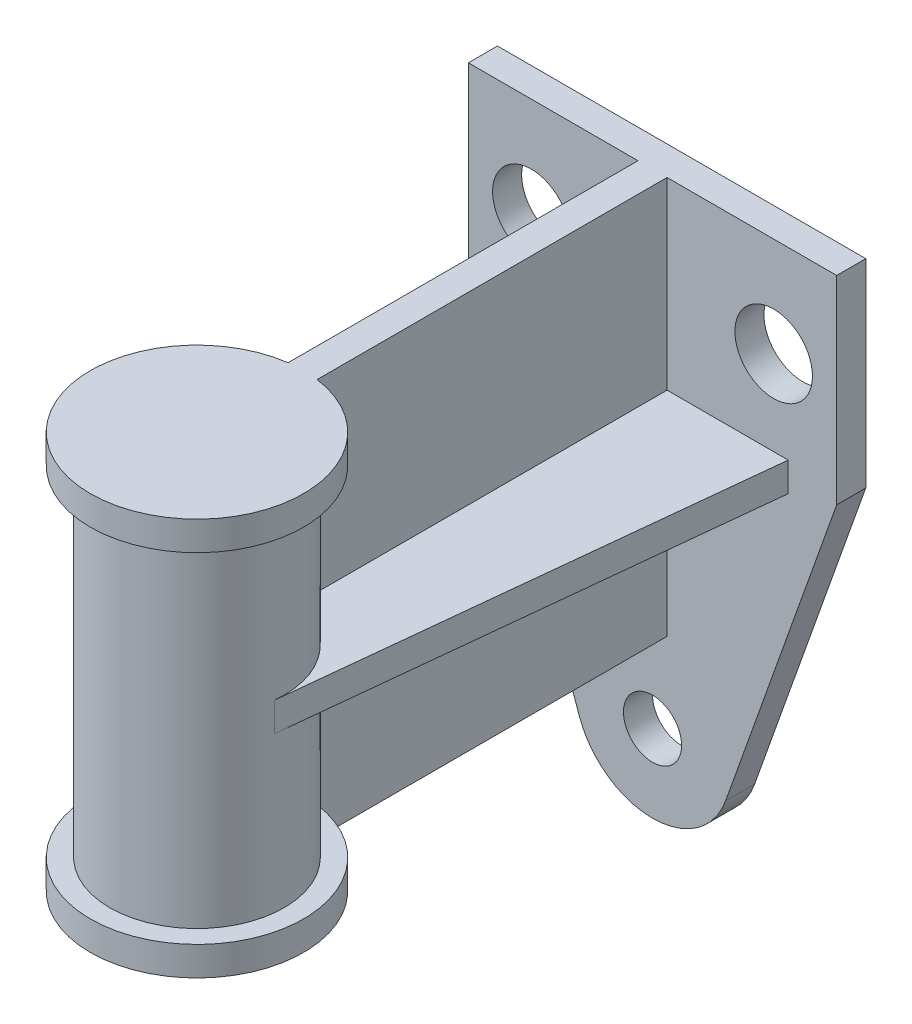
ISO-10303-21;
HEADER;
FILE_DESCRIPTION(('STEP AP214'),'2;1');
FILE_NAME('part.step','',(''),(''),'','','');
FILE_SCHEMA(('AUTOMOTIVE_DESIGN { 1 0 10303 214 1 1 1 1 }'));
ENDSEC;
DATA;
#1=APPLICATION_CONTEXT('core data for automotive mechanical design processes');
#2=APPLICATION_PROTOCOL_DEFINITION('international standard','automotive_design',2000,#1);
#3=PRODUCT_CONTEXT('',#1,'mechanical');
#4=PRODUCT('Part','Part','',(#3));
#5=PRODUCT_RELATED_PRODUCT_CATEGORY('part','',(#4));
#6=PRODUCT_DEFINITION_FORMATION('','',#4);
#7=PRODUCT_DEFINITION_CONTEXT('part definition',#1,'design');
#8=PRODUCT_DEFINITION('design','',#6,#7);
#9=PRODUCT_DEFINITION_SHAPE('','',#8);
#10=(LENGTH_UNIT() NAMED_UNIT(*) SI_UNIT(.MILLI.,.METRE.));
#11=(NAMED_UNIT(*) PLANE_ANGLE_UNIT() SI_UNIT($,.RADIAN.));
#12=(NAMED_UNIT(*) SI_UNIT($,.STERADIAN.) SOLID_ANGLE_UNIT());
#13=UNCERTAINTY_MEASURE_WITH_UNIT(LENGTH_MEASURE(1.E-05),#10,'distance_accuracy_value','');
#14=(GEOMETRIC_REPRESENTATION_CONTEXT(3) GLOBAL_UNCERTAINTY_ASSIGNED_CONTEXT((#13)) GLOBAL_UNIT_ASSIGNED_CONTEXT((#10,
#11,#12)) REPRESENTATION_CONTEXT('',''));
#15=CARTESIAN_POINT('',(0.,0.,0.));
#16=DIRECTION('',(0.,0.,1.));
#17=DIRECTION('',(1.,0.,0.));
#18=AXIS2_PLACEMENT_3D('',#15,#16,#17);
#19=CARTESIAN_POINT('',(3.,0.,0.));
#20=DIRECTION('',(-1.,0.,0.));
#21=DIRECTION('',(0.,0.,1.));
#22=AXIS2_PLACEMENT_3D('',#19,#20,#21);
#23=PLANE('',#22);
#24=DIRECTION('',(0.,0.,-1.));
#25=VECTOR('',#24,1.);
#26=CARTESIAN_POINT('',(3.,-3.,0.));
#27=LINE('',#26,#25);
#28=CARTESIAN_POINT('',(3.,-3.,-17.7482393492989));
#29=VERTEX_POINT('',#28);
#30=CARTESIAN_POINT('',(3.,-3.,-94.));
#31=VERTEX_POINT('',#30);
#32=EDGE_CURVE('E69',#29,#31,#27,.T.);
#33=ORIENTED_EDGE('',*,*,#32,.F.);
#34=DIRECTION('',(0.,-1.,0.));
#35=VECTOR('',#34,1.);
#36=CARTESIAN_POINT('',(3.,41.,-17.7482393492988));
#37=LINE('',#36,#35);
#38=CARTESIAN_POINT('',(3.,-35.,-17.7482393492988));
#39=VERTEX_POINT('',#38);
#40=EDGE_CURVE('E262',#29,#39,#37,.T.);
#41=ORIENTED_EDGE('',*,*,#40,.T.);
#42=DIRECTION('',(0.,0.,1.));
#43=VECTOR('',#42,1.);
#44=CARTESIAN_POINT('',(3.,-35.,0.));
#45=LINE('',#44,#43);
#46=CARTESIAN_POINT('',(3.,-35.,-21.7944947177034));
#47=VERTEX_POINT('',#46);
#48=EDGE_CURVE('E331',#47,#39,#45,.T.);
#49=ORIENTED_EDGE('',*,*,#48,.F.);
#50=DIRECTION('',(0.,-1.,0.));
#51=VECTOR('',#50,1.);
#52=CARTESIAN_POINT('',(3.,-35.,-21.7944947177034));
#53=LINE('',#52,#51);
#54=CARTESIAN_POINT('',(3.,-41.,-21.7944947177034));
#55=VERTEX_POINT('',#54);
#56=EDGE_CURVE('E289',#47,#55,#53,.T.);
#57=ORIENTED_EDGE('',*,*,#56,.T.);
#58=DIRECTION('',(0.,0.,-1.));
#59=VECTOR('',#58,1.);
#60=CARTESIAN_POINT('',(3.,-41.,-94.));
#61=LINE('',#60,#59);
#62=CARTESIAN_POINT('',(3.,-41.,-94.));
#63=VERTEX_POINT('',#62);
#64=EDGE_CURVE('E229',#55,#63,#61,.T.);
#65=ORIENTED_EDGE('',*,*,#64,.T.);
#66=DIRECTION('',(0.,1.,0.));
#67=VECTOR('',#66,1.);
#68=CARTESIAN_POINT('',(3.,41.,-94.));
#69=LINE('',#68,#67);
#70=EDGE_CURVE('E228',#63,#31,#69,.T.);
#71=ORIENTED_EDGE('',*,*,#70,.T.);
#72=EDGE_LOOP('',(#33,#41,#49,#57,#65,#71));
#73=FACE_BOUND('',#72,.T.);
#74=ADVANCED_FACE('F45',(#73),#23,.F.);
#75=CARTESIAN_POINT('',(-3.,0.,0.));
#76=DIRECTION('',(-1.,0.,0.));
#77=DIRECTION('',(0.,0.,1.));
#78=AXIS2_PLACEMENT_3D('',#75,#76,#77);
#79=PLANE('',#78);
#80=DIRECTION('',(0.,-1.,0.));
#81=VECTOR('',#80,1.);
#82=CARTESIAN_POINT('',(-3.,41.,-17.7482393492988));
#83=LINE('',#82,#81);
#84=CARTESIAN_POINT('',(-3.,-3.,-17.7482393492989));
#85=VERTEX_POINT('',#84);
#86=CARTESIAN_POINT('',(-3.,-35.,-17.7482393492988));
#87=VERTEX_POINT('',#86);
#88=EDGE_CURVE('E257',#85,#87,#83,.T.);
#89=ORIENTED_EDGE('',*,*,#88,.F.);
#90=DIRECTION('',(0.,0.,-1.));
#91=VECTOR('',#90,1.);
#92=CARTESIAN_POINT('',(-3.,-3.,0.));
#93=LINE('',#92,#91);
#94=CARTESIAN_POINT('',(-3.,-3.,-94.));
#95=VERTEX_POINT('',#94);
#96=EDGE_CURVE('E302',#85,#95,#93,.T.);
#97=ORIENTED_EDGE('',*,*,#96,.T.);
#98=DIRECTION('',(0.,1.,0.));
#99=VECTOR('',#98,1.);
#100=CARTESIAN_POINT('',(-3.,41.,-94.));
#101=LINE('',#100,#99);
#102=CARTESIAN_POINT('',(-3.,-41.,-94.));
#103=VERTEX_POINT('',#102);
#104=EDGE_CURVE('E247',#103,#95,#101,.T.);
#105=ORIENTED_EDGE('',*,*,#104,.F.);
#106=DIRECTION('',(0.,0.,-1.));
#107=VECTOR('',#106,1.);
#108=CARTESIAN_POINT('',(-3.,-41.,-94.));
#109=LINE('',#108,#107);
#110=CARTESIAN_POINT('',(-3.,-41.,-21.7944947177034));
#111=VERTEX_POINT('',#110);
#112=EDGE_CURVE('E242',#111,#103,#109,.T.);
#113=ORIENTED_EDGE('',*,*,#112,.F.);
#114=DIRECTION('',(0.,-1.,0.));
#115=VECTOR('',#114,1.);
#116=CARTESIAN_POINT('',(-3.,-35.,-21.7944947177034));
#117=LINE('',#116,#115);
#118=CARTESIAN_POINT('',(-3.,-35.,-21.7944947177034));
#119=VERTEX_POINT('',#118);
#120=EDGE_CURVE('E278',#119,#111,#117,.T.);
#121=ORIENTED_EDGE('',*,*,#120,.F.);
#122=DIRECTION('',(0.,0.,1.));
#123=VECTOR('',#122,1.);
#124=CARTESIAN_POINT('',(-3.,-35.,0.));
#125=LINE('',#124,#123);
#126=EDGE_CURVE('E274',#119,#87,#125,.T.);
#127=ORIENTED_EDGE('',*,*,#126,.T.);
#128=EDGE_LOOP('',(#89,#97,#105,#113,#121,#127));
#129=FACE_BOUND('',#128,.T.);
#130=ADVANCED_FACE('F300',(#129),#79,.T.);
#131=CARTESIAN_POINT('',(0.,41.,0.));
#132=DIRECTION('',(0.,-1.,0.));
#133=DIRECTION('',(0.,0.,-1.));
#134=AXIS2_PLACEMENT_3D('',#131,#132,#133);
#135=CYLINDRICAL_SURFACE('',#134,18.);
#136=DIRECTION('',(0.,-1.,0.));
#137=VECTOR('',#136,1.);
#138=CARTESIAN_POINT('',(17.9009850994463,3.,1.88539981685634));
#139=LINE('',#138,#137);
#140=CARTESIAN_POINT('',(17.9009850994463,3.,1.88539981685634));
#141=VERTEX_POINT('',#140);
#142=CARTESIAN_POINT('',(17.9009850994463,-3.,1.88539981685634));
#143=VERTEX_POINT('',#142);
#144=EDGE_CURVE('E205',#141,#143,#139,.T.);
#145=ORIENTED_EDGE('',*,*,#144,.F.);
#146=CARTESIAN_POINT('',(0.,3.,0.));
#147=DIRECTION('',(0.,1.,0.));
#148=DIRECTION('',(0.,0.,1.));
#149=AXIS2_PLACEMENT_3D('',#146,#147,#148);
#150=CIRCLE('',#149,18.);
#151=CARTESIAN_POINT('',(3.,3.,-17.7482393492989));
#152=VERTEX_POINT('',#151);
#153=EDGE_CURVE('E212',#141,#152,#150,.T.);
#154=ORIENTED_EDGE('',*,*,#153,.T.);
#155=CARTESIAN_POINT('',(3.,35.,-17.7482393492988));
#156=VERTEX_POINT('',#155);
#157=EDGE_CURVE('E263',#156,#152,#37,.T.);
#158=ORIENTED_EDGE('',*,*,#157,.F.);
#159=CARTESIAN_POINT('',(0.,35.,0.));
#160=DIRECTION('',(0.,1.,0.));
#161=DIRECTION('',(0.,0.,1.));
#162=AXIS2_PLACEMENT_3D('',#159,#160,#161);
#163=CIRCLE('',#162,18.);
#164=CARTESIAN_POINT('',(-3.,35.,-17.7482393492988));
#165=VERTEX_POINT('',#164);
#166=EDGE_CURVE('E342',#165,#156,#163,.T.);
#167=ORIENTED_EDGE('',*,*,#166,.F.);
#168=CARTESIAN_POINT('',(-3.,3.,-17.7482393492989));
#169=VERTEX_POINT('',#168);
#170=EDGE_CURVE('E258',#165,#169,#83,.T.);
#171=ORIENTED_EDGE('',*,*,#170,.T.);
#172=CARTESIAN_POINT('',(-17.9009850994463,3.,1.88539981685634));
#173=VERTEX_POINT('',#172);
#174=EDGE_CURVE('E214',#169,#173,#150,.T.);
#175=ORIENTED_EDGE('',*,*,#174,.T.);
#176=DIRECTION('',(0.,-1.,0.));
#177=VECTOR('',#176,1.);
#178=CARTESIAN_POINT('',(-17.9009850994463,3.,1.88539981685634));
#179=LINE('',#178,#177);
#180=CARTESIAN_POINT('',(-17.9009850994463,-3.,1.88539981685634));
#181=VERTEX_POINT('',#180);
#182=EDGE_CURVE('E311',#173,#181,#179,.T.);
#183=ORIENTED_EDGE('',*,*,#182,.T.);
#184=CARTESIAN_POINT('',(0.,-3.,0.));
#185=DIRECTION('',(0.,1.,0.));
#186=DIRECTION('',(0.,0.,1.));
#187=AXIS2_PLACEMENT_3D('',#184,#185,#186);
#188=CIRCLE('',#187,18.);
#189=EDGE_CURVE('E481',#85,#181,#188,.T.);
#190=ORIENTED_EDGE('',*,*,#189,.F.);
#191=ORIENTED_EDGE('',*,*,#88,.T.);
#192=CARTESIAN_POINT('',(0.,-35.,0.));
#193=DIRECTION('',(0.,-1.,0.));
#194=DIRECTION('',(0.,0.,-1.));
#195=AXIS2_PLACEMENT_3D('',#192,#193,#194);
#196=CIRCLE('',#195,18.);
#197=EDGE_CURVE('E325',#39,#87,#196,.T.);
#198=ORIENTED_EDGE('',*,*,#197,.F.);
#199=ORIENTED_EDGE('',*,*,#40,.F.);
#200=EDGE_CURVE('E482',#143,#29,#188,.T.);
#201=ORIENTED_EDGE('',*,*,#200,.F.);
#202=EDGE_LOOP('',(#145,#154,#158,#167,#171,#175,#183,#190,#191,#198,#199,#201));
#203=FACE_BOUND('',#202,.T.);
#204=ADVANCED_FACE('F47',(#203),#135,.T.);
#205=CARTESIAN_POINT('',(0.,41.,0.));
#206=DIRECTION('',(0.,1.,0.));
#207=DIRECTION('',(0.,0.,1.));
#208=AXIS2_PLACEMENT_3D('',#205,#206,#207);
#209=PLANE('',#208);
#210=DIRECTION('',(0.,0.,1.));
#211=VECTOR('',#210,1.);
#212=CARTESIAN_POINT('',(-3.,41.,-13.));
#213=LINE('',#212,#211);
#214=CARTESIAN_POINT('',(-3.,41.,-94.));
#215=VERTEX_POINT('',#214);
#216=CARTESIAN_POINT('',(-3.,41.,-21.7944947177034));
#217=VERTEX_POINT('',#216);
#218=EDGE_CURVE('E235',#215,#217,#213,.T.);
#219=ORIENTED_EDGE('',*,*,#218,.T.);
#220=CARTESIAN_POINT('',(0.,41.,0.));
#221=DIRECTION('',(0.,1.,0.));
#222=DIRECTION('',(0.,0.,1.));
#223=AXIS2_PLACEMENT_3D('',#220,#221,#222);
#224=CIRCLE('',#223,22.);
#225=CARTESIAN_POINT('',(3.,41.,-21.7944947177034));
#226=VERTEX_POINT('',#225);
#227=EDGE_CURVE('E337',#217,#226,#224,.T.);
#228=ORIENTED_EDGE('',*,*,#227,.T.);
#229=DIRECTION('',(0.,0.,1.));
#230=VECTOR('',#229,1.);
#231=CARTESIAN_POINT('',(3.,41.,-13.));
#232=LINE('',#231,#230);
#233=CARTESIAN_POINT('',(3.,41.,-94.));
#234=VERTEX_POINT('',#233);
#235=EDGE_CURVE('E234',#234,#226,#232,.T.);
#236=ORIENTED_EDGE('',*,*,#235,.F.);
#237=DIRECTION('',(-1.,0.,0.));
#238=VECTOR('',#237,1.);
#239=CARTESIAN_POINT('',(-38.,41.,-94.));
#240=LINE('',#239,#238);
#241=CARTESIAN_POINT('',(38.,41.,-94.));
#242=VERTEX_POINT('',#241);
#243=EDGE_CURVE('E223',#242,#234,#240,.T.);
#244=ORIENTED_EDGE('',*,*,#243,.F.);
#245=DIRECTION('',(0.,0.,-1.));
#246=VECTOR('',#245,1.);
#247=CARTESIAN_POINT('',(38.,41.,-94.));
#248=LINE('',#247,#246);
#249=CARTESIAN_POINT('',(38.,41.,-100.));
#250=VERTEX_POINT('',#249);
#251=EDGE_CURVE('E246',#242,#250,#248,.T.);
#252=ORIENTED_EDGE('',*,*,#251,.T.);
#253=DIRECTION('',(-1.,0.,0.));
#254=VECTOR('',#253,1.);
#255=CARTESIAN_POINT('',(-38.,41.,-100.));
#256=LINE('',#255,#254);
#257=CARTESIAN_POINT('',(-38.,41.,-100.));
#258=VERTEX_POINT('',#257);
#259=EDGE_CURVE('E387',#250,#258,#256,.T.);
#260=ORIENTED_EDGE('',*,*,#259,.T.);
#261=DIRECTION('',(0.,0.,-1.));
#262=VECTOR('',#261,1.);
#263=CARTESIAN_POINT('',(-38.,41.,-94.));
#264=LINE('',#263,#262);
#265=CARTESIAN_POINT('',(-38.,41.,-94.));
#266=VERTEX_POINT('',#265);
#267=EDGE_CURVE('E416',#266,#258,#264,.T.);
#268=ORIENTED_EDGE('',*,*,#267,.F.);
#269=EDGE_CURVE('E367',#215,#266,#240,.T.);
#270=ORIENTED_EDGE('',*,*,#269,.F.);
#271=EDGE_LOOP('',(#219,#228,#236,#244,#252,#260,#268,#270));
#272=FACE_BOUND('',#271,.T.);
#273=ADVANCED_FACE('F423',(#272),#209,.T.);
#274=CARTESIAN_POINT('',(0.,-41.,0.));
#275=DIRECTION('',(0.,1.,0.));
#276=DIRECTION('',(0.,0.,1.));
#277=AXIS2_PLACEMENT_3D('',#274,#275,#276);
#278=PLANE('',#277);
#279=ORIENTED_EDGE('',*,*,#64,.F.);
#280=CARTESIAN_POINT('',(0.,-41.,0.));
#281=DIRECTION('',(0.,-1.,0.));
#282=DIRECTION('',(0.,0.,-1.));
#283=AXIS2_PLACEMENT_3D('',#280,#281,#282);
#284=CIRCLE('',#283,22.);
#285=EDGE_CURVE('E320',#55,#111,#284,.T.);
#286=ORIENTED_EDGE('',*,*,#285,.T.);
#287=ORIENTED_EDGE('',*,*,#112,.T.);
#288=DIRECTION('',(-1.,0.,0.));
#289=VECTOR('',#288,1.);
#290=CARTESIAN_POINT('',(3.,-41.,-94.));
#291=LINE('',#290,#289);
#292=EDGE_CURVE('E241',#63,#103,#291,.T.);
#293=ORIENTED_EDGE('',*,*,#292,.F.);
#294=EDGE_LOOP('',(#279,#286,#287,#293));
#295=FACE_BOUND('',#294,.T.);
#296=ADVANCED_FACE('F291',(#295),#278,.F.);
#297=ORIENTED_EDGE('',*,*,#157,.T.);
#298=DIRECTION('',(0.,0.,-1.));
#299=VECTOR('',#298,1.);
#300=CARTESIAN_POINT('',(3.,3.,0.));
#301=LINE('',#300,#299);
#302=CARTESIAN_POINT('',(3.,3.,-94.));
#303=VERTEX_POINT('',#302);
#304=EDGE_CURVE('E317',#152,#303,#301,.T.);
#305=ORIENTED_EDGE('',*,*,#304,.T.);
#306=EDGE_CURVE('E221',#303,#234,#69,.T.);
#307=ORIENTED_EDGE('',*,*,#306,.T.);
#308=ORIENTED_EDGE('',*,*,#235,.T.);
#309=DIRECTION('',(0.,1.,0.));
#310=VECTOR('',#309,1.);
#311=CARTESIAN_POINT('',(3.,35.,-21.7944947177034));
#312=LINE('',#311,#310);
#313=CARTESIAN_POINT('',(3.,35.,-21.7944947177034));
#314=VERTEX_POINT('',#313);
#315=EDGE_CURVE('E351',#226,#314,#312,.F.);
#316=ORIENTED_EDGE('',*,*,#315,.T.);
#317=DIRECTION('',(0.,0.,-1.));
#318=VECTOR('',#317,1.);
#319=CARTESIAN_POINT('',(3.,35.,0.));
#320=LINE('',#319,#318);
#321=EDGE_CURVE('E348',#156,#314,#320,.T.);
#322=ORIENTED_EDGE('',*,*,#321,.F.);
#323=EDGE_LOOP('',(#297,#305,#307,#308,#316,#322));
#324=FACE_BOUND('',#323,.T.);
#325=ADVANCED_FACE('F465',(#324),#23,.F.);
#326=DIRECTION('',(0.,0.,-1.));
#327=VECTOR('',#326,1.);
#328=CARTESIAN_POINT('',(-3.,3.,0.));
#329=LINE('',#328,#327);
#330=CARTESIAN_POINT('',(-3.,3.,-94.));
#331=VERTEX_POINT('',#330);
#332=EDGE_CURVE('E309',#169,#331,#329,.T.);
#333=ORIENTED_EDGE('',*,*,#332,.F.);
#334=ORIENTED_EDGE('',*,*,#170,.F.);
#335=DIRECTION('',(0.,0.,-1.));
#336=VECTOR('',#335,1.);
#337=CARTESIAN_POINT('',(-3.,35.,0.));
#338=LINE('',#337,#336);
#339=CARTESIAN_POINT('',(-3.,35.,-21.7944947177034));
#340=VERTEX_POINT('',#339);
#341=EDGE_CURVE('E267',#165,#340,#338,.T.);
#342=ORIENTED_EDGE('',*,*,#341,.T.);
#343=DIRECTION('',(0.,1.,0.));
#344=VECTOR('',#343,1.);
#345=CARTESIAN_POINT('',(-3.,35.,-21.7944947177034));
#346=LINE('',#345,#344);
#347=EDGE_CURVE('E271',#217,#340,#346,.F.);
#348=ORIENTED_EDGE('',*,*,#347,.F.);
#349=ORIENTED_EDGE('',*,*,#218,.F.);
#350=EDGE_CURVE('E245',#331,#215,#101,.T.);
#351=ORIENTED_EDGE('',*,*,#350,.F.);
#352=EDGE_LOOP('',(#333,#334,#342,#348,#349,#351));
#353=FACE_BOUND('',#352,.T.);
#354=ADVANCED_FACE('F455',(#353),#79,.T.);
#355=CARTESIAN_POINT('',(0.,-59.,-94.));
#356=DIRECTION('',(0.,0.,1.));
#357=DIRECTION('',(1.,0.,0.));
#358=AXIS2_PLACEMENT_3D('',#355,#356,#357);
#359=PLANE('',#358);
#360=CARTESIAN_POINT('',(25.,20.5,-94.));
#361=DIRECTION('',(0.,0.,1.));
#362=DIRECTION('',(1.,0.,0.));
#363=AXIS2_PLACEMENT_3D('',#360,#361,#362);
#364=CIRCLE('',#363,8.00000000000001);
#365=CARTESIAN_POINT('',(33.,20.5,-94.));
#366=VERTEX_POINT('',#365);
#367=EDGE_CURVE('E748',#366,#366,#364,.T.);
#368=ORIENTED_EDGE('',*,*,#367,.F.);
#369=EDGE_LOOP('',(#368));
#370=FACE_BOUND('',#369,.T.);
#371=CARTESIAN_POINT('',(-25.,20.5,-94.));
#372=DIRECTION('',(0.,0.,1.));
#373=DIRECTION('',(1.,0.,0.));
#374=AXIS2_PLACEMENT_3D('',#371,#372,#373);
#375=CIRCLE('',#374,8.00000000000001);
#376=CARTESIAN_POINT('',(-17.,20.5,-94.));
#377=VERTEX_POINT('',#376);
#378=EDGE_CURVE('E751',#377,#377,#375,.T.);
#379=ORIENTED_EDGE('',*,*,#378,.F.);
#380=EDGE_LOOP('',(#379));
#381=FACE_BOUND('',#380,.T.);
#382=DIRECTION('',(-1.,0.,0.));
#383=VECTOR('',#382,1.);
#384=CARTESIAN_POINT('',(0.,3.,-94.));
#385=LINE('',#384,#383);
#386=CARTESIAN_POINT('',(28.,3.,-94.));
#387=VERTEX_POINT('',#386);
#388=EDGE_CURVE('E11',#387,#303,#385,.T.);
#389=ORIENTED_EDGE('',*,*,#388,.F.);
#390=DIRECTION('',(0.,-1.,0.));
#391=VECTOR('',#390,1.);
#392=CARTESIAN_POINT('',(28.,3.,-94.));
#393=LINE('',#392,#391);
#394=CARTESIAN_POINT('',(28.,-3.,-94.));
#395=VERTEX_POINT('',#394);
#396=EDGE_CURVE('E195',#387,#395,#393,.T.);
#397=ORIENTED_EDGE('',*,*,#396,.T.);
#398=DIRECTION('',(-1.,0.,0.));
#399=VECTOR('',#398,1.);
#400=CARTESIAN_POINT('',(0.,-3.,-94.));
#401=LINE('',#400,#399);
#402=EDGE_CURVE('E54',#395,#31,#401,.T.);
#403=ORIENTED_EDGE('',*,*,#402,.T.);
#404=ORIENTED_EDGE('',*,*,#70,.F.);
#405=ORIENTED_EDGE('',*,*,#292,.T.);
#406=ORIENTED_EDGE('',*,*,#104,.T.);
#407=DIRECTION('',(1.,0.,0.));
#408=VECTOR('',#407,1.);
#409=CARTESIAN_POINT('',(-28.,-3.,-94.));
#410=LINE('',#409,#408);
#411=CARTESIAN_POINT('',(-28.,-3.,-94.));
#412=VERTEX_POINT('',#411);
#413=EDGE_CURVE('E296',#412,#95,#410,.T.);
#414=ORIENTED_EDGE('',*,*,#413,.F.);
#415=DIRECTION('',(0.,-1.,0.));
#416=VECTOR('',#415,1.);
#417=CARTESIAN_POINT('',(-28.,3.,-94.));
#418=LINE('',#417,#416);
#419=CARTESIAN_POINT('',(-28.,3.,-94.));
#420=VERTEX_POINT('',#419);
#421=EDGE_CURVE('E305',#420,#412,#418,.T.);
#422=ORIENTED_EDGE('',*,*,#421,.F.);
#423=DIRECTION('',(1.,0.,0.));
#424=VECTOR('',#423,1.);
#425=CARTESIAN_POINT('',(-28.,3.,-94.));
#426=LINE('',#425,#424);
#427=EDGE_CURVE('E215',#420,#331,#426,.T.);
#428=ORIENTED_EDGE('',*,*,#427,.T.);
#429=ORIENTED_EDGE('',*,*,#350,.T.);
#430=ORIENTED_EDGE('',*,*,#269,.T.);
#431=DIRECTION('',(0.,-1.,0.));
#432=VECTOR('',#431,1.);
#433=CARTESIAN_POINT('',(-38.,41.,-94.));
#434=LINE('',#433,#432);
#435=CARTESIAN_POINT('',(-38.,0.,-94.));
#436=VERTEX_POINT('',#435);
#437=EDGE_CURVE('E371',#266,#436,#434,.T.);
#438=ORIENTED_EDGE('',*,*,#437,.T.);
#439=DIRECTION('',(0.335541743449785,-0.942025338514139,0.));
#440=VECTOR('',#439,1.);
#441=CARTESIAN_POINT('',(-38.,0.,-94.));
#442=LINE('',#441,#440);
#443=CARTESIAN_POINT('',(-15.0724054162262,-64.3686678951966,-94.));
#444=VERTEX_POINT('',#443);
#445=EDGE_CURVE('E374',#436,#444,#442,.T.);
#446=ORIENTED_EDGE('',*,*,#445,.T.);
#447=CARTESIAN_POINT('',(0.,-59.,-94.));
#448=DIRECTION('',(0.,0.,1.));
#449=DIRECTION('',(1.,0.,0.));
#450=AXIS2_PLACEMENT_3D('',#447,#448,#449);
#451=CIRCLE('',#450,16.);
#452=CARTESIAN_POINT('',(15.0724054162262,-64.3686678951966,-94.));
#453=VERTEX_POINT('',#452);
#454=EDGE_CURVE('E377',#444,#453,#451,.T.);
#455=ORIENTED_EDGE('',*,*,#454,.T.);
#456=DIRECTION('',(0.335541743449785,0.942025338514139,0.));
#457=VECTOR('',#456,1.);
#458=CARTESIAN_POINT('',(38.,0.,-94.));
#459=LINE('',#458,#457);
#460=CARTESIAN_POINT('',(38.,0.,-94.));
#461=VERTEX_POINT('',#460);
#462=EDGE_CURVE('E380',#453,#461,#459,.T.);
#463=ORIENTED_EDGE('',*,*,#462,.T.);
#464=DIRECTION('',(0.,1.,0.));
#465=VECTOR('',#464,1.);
#466=CARTESIAN_POINT('',(38.,41.,-94.));
#467=LINE('',#466,#465);
#468=EDGE_CURVE('E364',#461,#242,#467,.T.);
#469=ORIENTED_EDGE('',*,*,#468,.T.);
#470=ORIENTED_EDGE('',*,*,#243,.T.);
#471=ORIENTED_EDGE('',*,*,#306,.F.);
#472=EDGE_LOOP('',(#389,#397,#403,#404,#405,#406,#414,#422,#428,#429,#430,#438,#446,#455,#463,
#469,#470,#471));
#473=FACE_BOUND('',#472,.T.);
#474=CARTESIAN_POINT('',(0.,-59.,-94.));
#475=DIRECTION('',(0.,0.,1.));
#476=DIRECTION('',(1.,0.,0.));
#477=AXIS2_PLACEMENT_3D('',#474,#475,#476);
#478=CIRCLE('',#477,6.);
#479=CARTESIAN_POINT('',(6.00000000000001,-59.,-94.));
#480=VERTEX_POINT('',#479);
#481=EDGE_CURVE('E356',#480,#480,#478,.T.);
#482=ORIENTED_EDGE('',*,*,#481,.F.);
#483=EDGE_LOOP('',(#482));
#484=FACE_BOUND('',#483,.T.);
#485=ADVANCED_FACE('F218',(#370,#381,#473,#484),#359,.T.);
#486=CARTESIAN_POINT('',(0.,-59.,-100.));
#487=DIRECTION('',(0.,0.,1.));
#488=DIRECTION('',(1.,0.,0.));
#489=AXIS2_PLACEMENT_3D('',#486,#487,#488);
#490=PLANE('',#489);
#491=CARTESIAN_POINT('',(25.,20.5,-100.));
#492=DIRECTION('',(0.,0.,1.));
#493=DIRECTION('',(1.,0.,0.));
#494=AXIS2_PLACEMENT_3D('',#491,#492,#493);
#495=CIRCLE('',#494,8.00000000000001);
#496=CARTESIAN_POINT('',(33.,20.5,-100.));
#497=VERTEX_POINT('',#496);
#498=EDGE_CURVE('E754',#497,#497,#495,.T.);
#499=ORIENTED_EDGE('',*,*,#498,.T.);
#500=EDGE_LOOP('',(#499));
#501=FACE_BOUND('',#500,.T.);
#502=CARTESIAN_POINT('',(-25.,20.5,-100.));
#503=DIRECTION('',(0.,0.,1.));
#504=DIRECTION('',(1.,0.,0.));
#505=AXIS2_PLACEMENT_3D('',#502,#503,#504);
#506=CIRCLE('',#505,8.00000000000001);
#507=CARTESIAN_POINT('',(-17.,20.5,-100.));
#508=VERTEX_POINT('',#507);
#509=EDGE_CURVE('E478',#508,#508,#506,.T.);
#510=ORIENTED_EDGE('',*,*,#509,.T.);
#511=EDGE_LOOP('',(#510));
#512=FACE_BOUND('',#511,.T.);
#513=DIRECTION('',(0.,1.,0.));
#514=VECTOR('',#513,1.);
#515=CARTESIAN_POINT('',(38.,41.,-100.));
#516=LINE('',#515,#514);
#517=CARTESIAN_POINT('',(38.,0.,-100.));
#518=VERTEX_POINT('',#517);
#519=EDGE_CURVE('E360',#518,#250,#516,.T.);
#520=ORIENTED_EDGE('',*,*,#519,.F.);
#521=DIRECTION('',(0.335541743449785,0.942025338514139,0.));
#522=VECTOR('',#521,1.);
#523=CARTESIAN_POINT('',(38.,0.,-100.));
#524=LINE('',#523,#522);
#525=CARTESIAN_POINT('',(15.0724054162262,-64.3686678951966,-100.));
#526=VERTEX_POINT('',#525);
#527=EDGE_CURVE('E368',#526,#518,#524,.T.);
#528=ORIENTED_EDGE('',*,*,#527,.F.);
#529=CARTESIAN_POINT('',(0.,-59.,-100.));
#530=DIRECTION('',(0.,0.,1.));
#531=DIRECTION('',(1.,0.,0.));
#532=AXIS2_PLACEMENT_3D('',#529,#530,#531);
#533=CIRCLE('',#532,16.);
#534=CARTESIAN_POINT('',(-15.0724054162262,-64.3686678951966,-100.));
#535=VERTEX_POINT('',#534);
#536=EDGE_CURVE('E396',#535,#526,#533,.T.);
#537=ORIENTED_EDGE('',*,*,#536,.F.);
#538=DIRECTION('',(0.335541743449785,-0.942025338514139,0.));
#539=VECTOR('',#538,1.);
#540=CARTESIAN_POINT('',(-38.,0.,-100.));
#541=LINE('',#540,#539);
#542=CARTESIAN_POINT('',(-38.,0.,-100.));
#543=VERTEX_POINT('',#542);
#544=EDGE_CURVE('E393',#543,#535,#541,.T.);
#545=ORIENTED_EDGE('',*,*,#544,.F.);
#546=DIRECTION('',(0.,-1.,0.));
#547=VECTOR('',#546,1.);
#548=CARTESIAN_POINT('',(-38.,41.,-100.));
#549=LINE('',#548,#547);
#550=EDGE_CURVE('E390',#258,#543,#549,.T.);
#551=ORIENTED_EDGE('',*,*,#550,.F.);
#552=ORIENTED_EDGE('',*,*,#259,.F.);
#553=EDGE_LOOP('',(#520,#528,#537,#545,#551,#552));
#554=FACE_BOUND('',#553,.T.);
#555=CARTESIAN_POINT('',(0.,-59.,-100.));
#556=DIRECTION('',(0.,0.,1.));
#557=DIRECTION('',(1.,0.,0.));
#558=AXIS2_PLACEMENT_3D('',#555,#556,#557);
#559=CIRCLE('',#558,6.);
#560=CARTESIAN_POINT('',(6.00000000000001,-59.,-100.));
#561=VERTEX_POINT('',#560);
#562=EDGE_CURVE('E355',#561,#561,#559,.T.);
#563=ORIENTED_EDGE('',*,*,#562,.T.);
#564=EDGE_LOOP('',(#563));
#565=FACE_BOUND('',#564,.T.);
#566=ADVANCED_FACE('F432',(#501,#512,#554,#565),#490,.F.);
#567=CARTESIAN_POINT('',(38.,41.,-94.));
#568=DIRECTION('',(-1.,0.,0.));
#569=DIRECTION('',(0.,-1.,0.));
#570=AXIS2_PLACEMENT_3D('',#567,#568,#569);
#571=PLANE('',#570);
#572=ORIENTED_EDGE('',*,*,#519,.T.);
#573=ORIENTED_EDGE('',*,*,#251,.F.);
#574=ORIENTED_EDGE('',*,*,#468,.F.);
#575=DIRECTION('',(0.,0.,-1.));
#576=VECTOR('',#575,1.);
#577=CARTESIAN_POINT('',(38.,0.,-94.));
#578=LINE('',#577,#576);
#579=EDGE_CURVE('E383',#461,#518,#578,.T.);
#580=ORIENTED_EDGE('',*,*,#579,.T.);
#581=EDGE_LOOP('',(#572,#573,#574,#580));
#582=FACE_BOUND('',#581,.T.);
#583=ADVANCED_FACE('F428',(#582),#571,.F.);
#584=CARTESIAN_POINT('',(-38.,41.,-94.));
#585=DIRECTION('',(1.,0.,0.));
#586=DIRECTION('',(0.,0.,-1.));
#587=AXIS2_PLACEMENT_3D('',#584,#585,#586);
#588=PLANE('',#587);
#589=ORIENTED_EDGE('',*,*,#550,.T.);
#590=DIRECTION('',(0.,0.,-1.));
#591=VECTOR('',#590,1.);
#592=CARTESIAN_POINT('',(-38.,0.,-94.));
#593=LINE('',#592,#591);
#594=EDGE_CURVE('E412',#436,#543,#593,.T.);
#595=ORIENTED_EDGE('',*,*,#594,.F.);
#596=ORIENTED_EDGE('',*,*,#437,.F.);
#597=ORIENTED_EDGE('',*,*,#267,.T.);
#598=EDGE_LOOP('',(#589,#595,#596,#597));
#599=FACE_BOUND('',#598,.T.);
#600=ADVANCED_FACE('F439',(#599),#588,.F.);
#601=CARTESIAN_POINT('',(-38.,0.,-94.));
#602=DIRECTION('',(0.942025338514139,0.335541743449785,0.));
#603=DIRECTION('',(-0.335541743449785,0.942025338514139,0.));
#604=AXIS2_PLACEMENT_3D('',#601,#602,#603);
#605=PLANE('',#604);
#606=ORIENTED_EDGE('',*,*,#544,.T.);
#607=DIRECTION('',(0.,0.,-1.));
#608=VECTOR('',#607,1.);
#609=CARTESIAN_POINT('',(-15.0724054162262,-64.3686678951966,-94.));
#610=LINE('',#609,#608);
#611=EDGE_CURVE('E408',#444,#535,#610,.T.);
#612=ORIENTED_EDGE('',*,*,#611,.F.);
#613=ORIENTED_EDGE('',*,*,#445,.F.);
#614=ORIENTED_EDGE('',*,*,#594,.T.);
#615=EDGE_LOOP('',(#606,#612,#613,#614));
#616=FACE_BOUND('',#615,.T.);
#617=ADVANCED_FACE('F443',(#616),#605,.F.);
#618=CARTESIAN_POINT('',(0.,-59.,-94.));
#619=DIRECTION('',(0.,0.,-1.));
#620=DIRECTION('',(-1.,0.,0.));
#621=AXIS2_PLACEMENT_3D('',#618,#619,#620);
#622=CYLINDRICAL_SURFACE('',#621,16.);
#623=ORIENTED_EDGE('',*,*,#536,.T.);
#624=DIRECTION('',(0.,0.,-1.));
#625=VECTOR('',#624,1.);
#626=CARTESIAN_POINT('',(15.0724054162262,-64.3686678951966,-94.));
#627=LINE('',#626,#625);
#628=EDGE_CURVE('E404',#453,#526,#627,.T.);
#629=ORIENTED_EDGE('',*,*,#628,.F.);
#630=ORIENTED_EDGE('',*,*,#454,.F.);
#631=ORIENTED_EDGE('',*,*,#611,.T.);
#632=EDGE_LOOP('',(#623,#629,#630,#631));
#633=FACE_BOUND('',#632,.T.);
#634=ADVANCED_FACE('F705',(#633),#622,.T.);
#635=CARTESIAN_POINT('',(38.,0.,-94.));
#636=DIRECTION('',(-0.942025338514139,0.335541743449785,0.));
#637=DIRECTION('',(-0.335541743449785,-0.942025338514139,0.));
#638=AXIS2_PLACEMENT_3D('',#635,#636,#637);
#639=PLANE('',#638);
#640=ORIENTED_EDGE('',*,*,#527,.T.);
#641=ORIENTED_EDGE('',*,*,#579,.F.);
#642=ORIENTED_EDGE('',*,*,#462,.F.);
#643=ORIENTED_EDGE('',*,*,#628,.T.);
#644=EDGE_LOOP('',(#640,#641,#642,#643));
#645=FACE_BOUND('',#644,.T.);
#646=ADVANCED_FACE('F713',(#645),#639,.F.);
#647=CARTESIAN_POINT('',(0.,-59.,-94.));
#648=DIRECTION('',(0.,0.,-1.));
#649=DIRECTION('',(-1.,0.,0.));
#650=AXIS2_PLACEMENT_3D('',#647,#648,#649);
#651=CYLINDRICAL_SURFACE('',#650,6.);
#652=ORIENTED_EDGE('',*,*,#481,.T.);
#653=EDGE_LOOP('',(#652));
#654=FACE_BOUND('',#653,.T.);
#655=ORIENTED_EDGE('',*,*,#562,.F.);
#656=EDGE_LOOP('',(#655));
#657=FACE_BOUND('',#656,.T.);
#658=ADVANCED_FACE('F655',(#654,#657),#651,.F.);
#659=CARTESIAN_POINT('',(0.,35.,0.));
#660=DIRECTION('',(0.,1.,0.));
#661=DIRECTION('',(0.,0.,1.));
#662=AXIS2_PLACEMENT_3D('',#659,#660,#661);
#663=CYLINDRICAL_SURFACE('',#662,22.);
#664=ORIENTED_EDGE('',*,*,#315,.F.);
#665=ORIENTED_EDGE('',*,*,#227,.F.);
#666=ORIENTED_EDGE('',*,*,#347,.T.);
#667=CARTESIAN_POINT('',(0.,35.,0.));
#668=DIRECTION('',(0.,1.,0.));
#669=DIRECTION('',(0.,0.,1.));
#670=AXIS2_PLACEMENT_3D('',#667,#668,#669);
#671=CIRCLE('',#670,22.);
#672=EDGE_CURVE('E338',#340,#314,#671,.T.);
#673=ORIENTED_EDGE('',*,*,#672,.T.);
#674=EDGE_LOOP('',(#664,#665,#666,#673));
#675=FACE_BOUND('',#674,.T.);
#676=ADVANCED_FACE('F459',(#675),#663,.T.);
#677=CARTESIAN_POINT('',(0.,35.,0.));
#678=DIRECTION('',(0.,1.,0.));
#679=DIRECTION('',(0.,0.,1.));
#680=AXIS2_PLACEMENT_3D('',#677,#678,#679);
#681=PLANE('',#680);
#682=ORIENTED_EDGE('',*,*,#166,.T.);
#683=ORIENTED_EDGE('',*,*,#321,.T.);
#684=ORIENTED_EDGE('',*,*,#672,.F.);
#685=ORIENTED_EDGE('',*,*,#341,.F.);
#686=EDGE_LOOP('',(#682,#683,#684,#685));
#687=FACE_BOUND('',#686,.T.);
#688=ADVANCED_FACE('F461',(#687),#681,.F.);
#689=CARTESIAN_POINT('',(0.,-35.,0.));
#690=DIRECTION('',(0.,-1.,0.));
#691=DIRECTION('',(0.,0.,-1.));
#692=AXIS2_PLACEMENT_3D('',#689,#690,#691);
#693=CYLINDRICAL_SURFACE('',#692,22.);
#694=ORIENTED_EDGE('',*,*,#56,.F.);
#695=CARTESIAN_POINT('',(0.,-35.,0.));
#696=DIRECTION('',(0.,-1.,0.));
#697=DIRECTION('',(0.,0.,-1.));
#698=AXIS2_PLACEMENT_3D('',#695,#696,#697);
#699=CIRCLE('',#698,22.);
#700=EDGE_CURVE('E321',#47,#119,#699,.T.);
#701=ORIENTED_EDGE('',*,*,#700,.T.);
#702=ORIENTED_EDGE('',*,*,#120,.T.);
#703=ORIENTED_EDGE('',*,*,#285,.F.);
#704=EDGE_LOOP('',(#694,#701,#702,#703));
#705=FACE_BOUND('',#704,.T.);
#706=ADVANCED_FACE('F498',(#705),#693,.T.);
#707=CARTESIAN_POINT('',(0.,-35.,0.));
#708=DIRECTION('',(0.,-1.,0.));
#709=DIRECTION('',(0.,0.,-1.));
#710=AXIS2_PLACEMENT_3D('',#707,#708,#709);
#711=PLANE('',#710);
#712=ORIENTED_EDGE('',*,*,#700,.F.);
#713=ORIENTED_EDGE('',*,*,#48,.T.);
#714=ORIENTED_EDGE('',*,*,#197,.T.);
#715=ORIENTED_EDGE('',*,*,#126,.F.);
#716=EDGE_LOOP('',(#712,#713,#714,#715));
#717=FACE_BOUND('',#716,.T.);
#718=ADVANCED_FACE('F496',(#717),#711,.F.);
#719=CARTESIAN_POINT('',(0.,3.,0.));
#720=DIRECTION('',(0.,1.,0.));
#721=DIRECTION('',(0.,0.,1.));
#722=AXIS2_PLACEMENT_3D('',#719,#720,#721);
#723=PLANE('',#722);
#724=ORIENTED_EDGE('',*,*,#174,.F.);
#725=ORIENTED_EDGE('',*,*,#332,.T.);
#726=ORIENTED_EDGE('',*,*,#427,.F.);
#727=DIRECTION('',(0.104744434269797,0.,0.994499172191461));
#728=VECTOR('',#727,1.);
#729=CARTESIAN_POINT('',(-28.,3.,-94.));
#730=LINE('',#729,#728);
#731=EDGE_CURVE('E206',#420,#173,#730,.T.);
#732=ORIENTED_EDGE('',*,*,#731,.T.);
#733=EDGE_LOOP('',(#724,#725,#726,#732));
#734=FACE_BOUND('',#733,.T.);
#735=ADVANCED_FACE('F505',(#734),#723,.T.);
#736=CARTESIAN_POINT('',(0.,-3.,0.));
#737=DIRECTION('',(0.,1.,0.));
#738=DIRECTION('',(0.,0.,1.));
#739=AXIS2_PLACEMENT_3D('',#736,#737,#738);
#740=PLANE('',#739);
#741=ORIENTED_EDGE('',*,*,#96,.F.);
#742=ORIENTED_EDGE('',*,*,#189,.T.);
#743=DIRECTION('',(0.104744434269797,0.,0.994499172191461));
#744=VECTOR('',#743,1.);
#745=CARTESIAN_POINT('',(-28.,-3.,-94.));
#746=LINE('',#745,#744);
#747=EDGE_CURVE('E61',#412,#181,#746,.T.);
#748=ORIENTED_EDGE('',*,*,#747,.F.);
#749=ORIENTED_EDGE('',*,*,#413,.T.);
#750=EDGE_LOOP('',(#741,#742,#748,#749));
#751=FACE_BOUND('',#750,.T.);
#752=ADVANCED_FACE('F553',(#751),#740,.F.);
#753=CARTESIAN_POINT('',(-28.,3.,-94.));
#754=DIRECTION('',(0.994499172191461,0.,-0.104744434269797));
#755=DIRECTION('',(-0.104744434269797,0.,-0.994499172191461));
#756=AXIS2_PLACEMENT_3D('',#753,#754,#755);
#757=PLANE('',#756);
#758=ORIENTED_EDGE('',*,*,#747,.T.);
#759=ORIENTED_EDGE('',*,*,#182,.F.);
#760=ORIENTED_EDGE('',*,*,#731,.F.);
#761=ORIENTED_EDGE('',*,*,#421,.T.);
#762=EDGE_LOOP('',(#758,#759,#760,#761));
#763=FACE_BOUND('',#762,.T.);
#764=ADVANCED_FACE('F562',(#763),#757,.F.);
#765=ORIENTED_EDGE('',*,*,#304,.F.);
#766=ORIENTED_EDGE('',*,*,#153,.F.);
#767=DIRECTION('',(-0.104744434269797,0.,0.994499172191461));
#768=VECTOR('',#767,1.);
#769=CARTESIAN_POINT('',(28.,3.,-94.));
#770=LINE('',#769,#768);
#771=EDGE_CURVE('E198',#387,#141,#770,.T.);
#772=ORIENTED_EDGE('',*,*,#771,.F.);
#773=ORIENTED_EDGE('',*,*,#388,.T.);
#774=EDGE_LOOP('',(#765,#766,#772,#773));
#775=FACE_BOUND('',#774,.T.);
#776=ADVANCED_FACE('F209',(#775),#723,.T.);
#777=ORIENTED_EDGE('',*,*,#200,.T.);
#778=ORIENTED_EDGE('',*,*,#32,.T.);
#779=ORIENTED_EDGE('',*,*,#402,.F.);
#780=DIRECTION('',(-0.104744434269797,0.,0.994499172191461));
#781=VECTOR('',#780,1.);
#782=CARTESIAN_POINT('',(28.,-3.,-94.));
#783=LINE('',#782,#781);
#784=EDGE_CURVE('E201',#395,#143,#783,.T.);
#785=ORIENTED_EDGE('',*,*,#784,.T.);
#786=EDGE_LOOP('',(#777,#778,#779,#785));
#787=FACE_BOUND('',#786,.T.);
#788=ADVANCED_FACE('F490',(#787),#740,.F.);
#789=CARTESIAN_POINT('',(28.,3.,-94.));
#790=DIRECTION('',(0.994499172191461,0.,0.104744434269797));
#791=DIRECTION('',(0.104744434269797,0.,-0.994499172191461));
#792=AXIS2_PLACEMENT_3D('',#789,#790,#791);
#793=PLANE('',#792);
#794=ORIENTED_EDGE('',*,*,#784,.F.);
#795=ORIENTED_EDGE('',*,*,#396,.F.);
#796=ORIENTED_EDGE('',*,*,#771,.T.);
#797=ORIENTED_EDGE('',*,*,#144,.T.);
#798=EDGE_LOOP('',(#794,#795,#796,#797));
#799=FACE_BOUND('',#798,.T.);
#800=ADVANCED_FACE('F197',(#799),#793,.T.);
#801=CARTESIAN_POINT('',(-25.,20.5,-94.));
#802=DIRECTION('',(0.,0.,1.));
#803=DIRECTION('',(1.,0.,0.));
#804=AXIS2_PLACEMENT_3D('',#801,#802,#803);
#805=CYLINDRICAL_SURFACE('',#804,8.00000000000001);
#806=ORIENTED_EDGE('',*,*,#509,.F.);
#807=EDGE_LOOP('',(#806));
#808=FACE_BOUND('',#807,.T.);
#809=ORIENTED_EDGE('',*,*,#378,.T.);
#810=EDGE_LOOP('',(#809));
#811=FACE_BOUND('',#810,.T.);
#812=ADVANCED_FACE('F590',(#808,#811),#805,.F.);
#813=CARTESIAN_POINT('',(25.,20.5,-94.));
#814=DIRECTION('',(0.,0.,1.));
#815=DIRECTION('',(1.,0.,0.));
#816=AXIS2_PLACEMENT_3D('',#813,#814,#815);
#817=CYLINDRICAL_SURFACE('',#816,8.00000000000001);
#818=ORIENTED_EDGE('',*,*,#498,.F.);
#819=EDGE_LOOP('',(#818));
#820=FACE_BOUND('',#819,.T.);
#821=ORIENTED_EDGE('',*,*,#367,.T.);
#822=EDGE_LOOP('',(#821));
#823=FACE_BOUND('',#822,.T.);
#824=ADVANCED_FACE('F598',(#820,#823),#817,.F.);
#825=CLOSED_SHELL('',(#74,#130,#204,#273,#296,#325,#354,#485,#566,#583,#600,#617,#634,#646,#658,
#676,#688,#706,#718,#735,#752,#764,#776,#788,#800,#812,#824));
#826=MANIFOLD_SOLID_BREP('B2',#825);
#827=ADVANCED_BREP_SHAPE_REPRESENTATION('',(#18,#826),#14);
#828=SHAPE_DEFINITION_REPRESENTATION(#9,#827);
ENDSEC;
END-ISO-10303-21;
